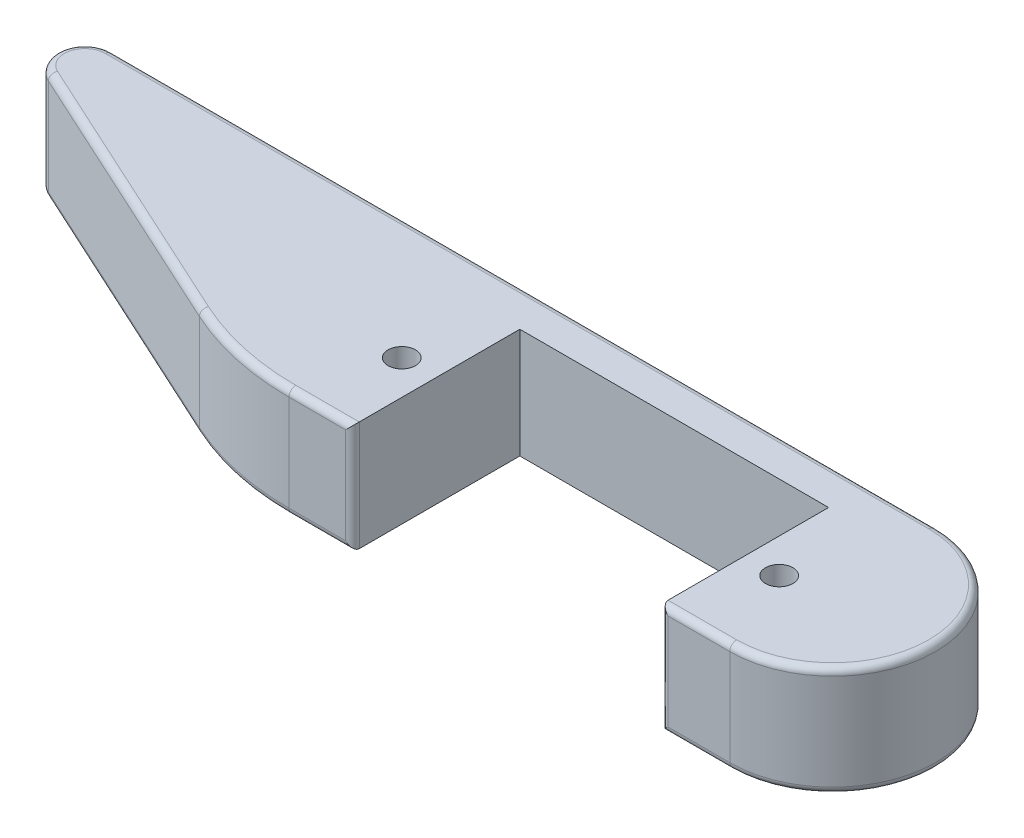
ISO-10303-21;
HEADER;
FILE_DESCRIPTION(('STEP AP214'),'2;1');
FILE_NAME('part.step','',(''),(''),'','','');
FILE_SCHEMA(('AUTOMOTIVE_DESIGN { 1 0 10303 214 1 1 1 1 }'));
ENDSEC;
DATA;
#1=APPLICATION_CONTEXT('core data for automotive mechanical design processes');
#2=APPLICATION_PROTOCOL_DEFINITION('international standard','automotive_design',2000,#1);
#3=PRODUCT_CONTEXT('',#1,'mechanical');
#4=PRODUCT('Part','Part','',(#3));
#5=PRODUCT_RELATED_PRODUCT_CATEGORY('part','',(#4));
#6=PRODUCT_DEFINITION_FORMATION('','',#4);
#7=PRODUCT_DEFINITION_CONTEXT('part definition',#1,'design');
#8=PRODUCT_DEFINITION('design','',#6,#7);
#9=PRODUCT_DEFINITION_SHAPE('','',#8);
#10=(LENGTH_UNIT() NAMED_UNIT(*) SI_UNIT(.MILLI.,.METRE.));
#11=(NAMED_UNIT(*) PLANE_ANGLE_UNIT() SI_UNIT($,.RADIAN.));
#12=(NAMED_UNIT(*) SI_UNIT($,.STERADIAN.) SOLID_ANGLE_UNIT());
#13=UNCERTAINTY_MEASURE_WITH_UNIT(LENGTH_MEASURE(1.E-05),#10,'distance_accuracy_value','');
#14=(GEOMETRIC_REPRESENTATION_CONTEXT(3) GLOBAL_UNCERTAINTY_ASSIGNED_CONTEXT((#13)) GLOBAL_UNIT_ASSIGNED_CONTEXT((#10,
#11,#12)) REPRESENTATION_CONTEXT('',''));
#15=CARTESIAN_POINT('',(0.,0.,0.));
#16=DIRECTION('',(0.,0.,1.));
#17=DIRECTION('',(1.,0.,0.));
#18=AXIS2_PLACEMENT_3D('',#15,#16,#17);
#19=CARTESIAN_POINT('',(-27.1243037321913,8.,-20.));
#20=DIRECTION('',(0.,1.,0.));
#21=DIRECTION('',(0.,0.,1.));
#22=AXIS2_PLACEMENT_3D('',#19,#20,#21);
#23=PLANE('',#22);
#24=DIRECTION('',(0.,0.,1.));
#25=VECTOR('',#24,1.);
#26=CARTESIAN_POINT('',(0.,8.,0.));
#27=LINE('',#26,#25);
#28=CARTESIAN_POINT('',(0.,8.,-12.2));
#29=VERTEX_POINT('',#28);
#30=CARTESIAN_POINT('',(0.,8.,-0.5));
#31=VERTEX_POINT('',#30);
#32=EDGE_CURVE('E183',#29,#31,#27,.T.);
#33=ORIENTED_EDGE('',*,*,#32,.T.);
#34=DIRECTION('',(1.,0.,0.));
#35=VECTOR('',#34,1.);
#36=CARTESIAN_POINT('',(5.,8.,-0.500000000000001));
#37=LINE('',#36,#35);
#38=CARTESIAN_POINT('',(5.,8.,-0.5));
#39=VERTEX_POINT('',#38);
#40=EDGE_CURVE('E223',#31,#39,#37,.T.);
#41=ORIENTED_EDGE('',*,*,#40,.T.);
#42=CARTESIAN_POINT('',(5.,8.,-7.5));
#43=DIRECTION('',(0.,1.,0.));
#44=DIRECTION('',(0.,0.,1.));
#45=AXIS2_PLACEMENT_3D('',#42,#43,#44);
#46=CIRCLE('',#45,7.);
#47=CARTESIAN_POINT('',(5.,8.,-14.5));
#48=VERTEX_POINT('',#47);
#49=EDGE_CURVE('E221',#39,#48,#46,.T.);
#50=ORIENTED_EDGE('',*,*,#49,.T.);
#51=DIRECTION('',(-1.,0.,0.));
#52=VECTOR('',#51,1.);
#53=CARTESIAN_POINT('',(-55.,8.,-14.5));
#54=LINE('',#53,#52);
#55=CARTESIAN_POINT('',(-55.,8.,-14.5));
#56=VERTEX_POINT('',#55);
#57=EDGE_CURVE('E212',#48,#56,#54,.T.);
#58=ORIENTED_EDGE('',*,*,#57,.T.);
#59=CARTESIAN_POINT('',(-55.,8.,-13.));
#60=DIRECTION('',(0.,1.,0.));
#61=DIRECTION('',(0.,0.,1.));
#62=AXIS2_PLACEMENT_3D('',#59,#60,#61);
#63=CIRCLE('',#62,1.5);
#64=CARTESIAN_POINT('',(-55.626320461274,8.,-11.6370169921127));
#65=VERTEX_POINT('',#64);
#66=EDGE_CURVE('E214',#56,#65,#63,.T.);
#67=ORIENTED_EDGE('',*,*,#66,.T.);
#68=DIRECTION('',(0.908655338591524,0.,0.417546974182694));
#69=VECTOR('',#68,1.);
#70=CARTESIAN_POINT('',(-35.2664697287539,8.,-2.2812208974653));
#71=LINE('',#70,#69);
#72=CARTESIAN_POINT('',(-35.2664697287539,8.,-2.2812208974653));
#73=VERTEX_POINT('',#72);
#74=EDGE_CURVE('E216',#65,#73,#71,.T.);
#75=ORIENTED_EDGE('',*,*,#74,.T.);
#76=CARTESIAN_POINT('',(-27.1243037321913,8.,-20.));
#77=DIRECTION('',(0.,1.,0.));
#78=DIRECTION('',(0.,0.,1.));
#79=AXIS2_PLACEMENT_3D('',#76,#77,#78);
#80=CIRCLE('',#79,19.5);
#81=CARTESIAN_POINT('',(-27.1243037321913,8.,-0.500000000000004));
#82=VERTEX_POINT('',#81);
#83=EDGE_CURVE('E218',#73,#82,#80,.T.);
#84=ORIENTED_EDGE('',*,*,#83,.T.);
#85=DIRECTION('',(1.,0.,0.));
#86=VECTOR('',#85,1.);
#87=CARTESIAN_POINT('',(-22.5,8.,-0.499999999999999));
#88=LINE('',#87,#86);
#89=CARTESIAN_POINT('',(-22.5,8.,-0.5));
#90=VERTEX_POINT('',#89);
#91=EDGE_CURVE('E166',#82,#90,#88,.T.);
#92=ORIENTED_EDGE('',*,*,#91,.T.);
#93=DIRECTION('',(0.,0.,-1.));
#94=VECTOR('',#93,1.);
#95=CARTESIAN_POINT('',(-22.5,8.,-12.2));
#96=LINE('',#95,#94);
#97=CARTESIAN_POINT('',(-22.5,8.,-12.2));
#98=VERTEX_POINT('',#97);
#99=EDGE_CURVE('E158',#90,#98,#96,.T.);
#100=ORIENTED_EDGE('',*,*,#99,.T.);
#101=DIRECTION('',(1.,0.,0.));
#102=VECTOR('',#101,1.);
#103=CARTESIAN_POINT('',(0.,8.,-12.2));
#104=LINE('',#103,#102);
#105=EDGE_CURVE('E163',#98,#29,#104,.T.);
#106=ORIENTED_EDGE('',*,*,#105,.T.);
#107=EDGE_LOOP('',(#33,#41,#50,#58,#67,#75,#84,#92,#100,#106));
#108=FACE_BOUND('',#107,.T.);
#109=CARTESIAN_POINT('',(-25.,8.,-6.1));
#110=DIRECTION('',(0.,1.,0.));
#111=DIRECTION('',(0.,0.,1.));
#112=AXIS2_PLACEMENT_3D('',#109,#110,#111);
#113=CIRCLE('',#112,1.);
#114=CARTESIAN_POINT('',(-25.,8.,-5.1));
#115=VERTEX_POINT('',#114);
#116=EDGE_CURVE('E190',#115,#115,#113,.T.);
#117=ORIENTED_EDGE('',*,*,#116,.F.);
#118=EDGE_LOOP('',(#117));
#119=FACE_BOUND('',#118,.T.);
#120=CARTESIAN_POINT('',(2.5,8.,-6.1));
#121=DIRECTION('',(0.,1.,0.));
#122=DIRECTION('',(0.,0.,1.));
#123=AXIS2_PLACEMENT_3D('',#120,#121,#122);
#124=CIRCLE('',#123,1.);
#125=CARTESIAN_POINT('',(2.5,8.,-5.1));
#126=VERTEX_POINT('',#125);
#127=EDGE_CURVE('E322',#126,#126,#124,.T.);
#128=ORIENTED_EDGE('',*,*,#127,.F.);
#129=EDGE_LOOP('',(#128));
#130=FACE_BOUND('',#129,.T.);
#131=ADVANCED_FACE('F33',(#108,#119,#130),#23,.T.);
#132=CARTESIAN_POINT('',(-27.1243037321913,0.,-20.));
#133=DIRECTION('',(0.,1.,0.));
#134=DIRECTION('',(0.,0.,1.));
#135=AXIS2_PLACEMENT_3D('',#132,#133,#134);
#136=PLANE('',#135);
#137=CARTESIAN_POINT('',(-25.,0.,-6.1));
#138=DIRECTION('',(0.,1.,0.));
#139=DIRECTION('',(0.,0.,1.));
#140=AXIS2_PLACEMENT_3D('',#137,#138,#139);
#141=CIRCLE('',#140,1.);
#142=CARTESIAN_POINT('',(-25.,0.,-5.1));
#143=VERTEX_POINT('',#142);
#144=EDGE_CURVE('E327',#143,#143,#141,.T.);
#145=ORIENTED_EDGE('',*,*,#144,.T.);
#146=EDGE_LOOP('',(#145));
#147=FACE_BOUND('',#146,.T.);
#148=CARTESIAN_POINT('',(5.,0.,-7.5));
#149=DIRECTION('',(0.,1.,0.));
#150=DIRECTION('',(0.,0.,1.));
#151=AXIS2_PLACEMENT_3D('',#148,#149,#150);
#152=CIRCLE('',#151,7.);
#153=CARTESIAN_POINT('',(5.,0.,-14.5));
#154=VERTEX_POINT('',#153);
#155=CARTESIAN_POINT('',(5.,0.,-0.5));
#156=VERTEX_POINT('',#155);
#157=EDGE_CURVE('E50',#154,#156,#152,.F.);
#158=ORIENTED_EDGE('',*,*,#157,.T.);
#159=DIRECTION('',(1.,0.,0.));
#160=VECTOR('',#159,1.);
#161=CARTESIAN_POINT('',(-27.1243037321913,0.,-0.5));
#162=LINE('',#161,#160);
#163=CARTESIAN_POINT('',(0.,0.,-0.5));
#164=VERTEX_POINT('',#163);
#165=EDGE_CURVE('E265',#156,#164,#162,.F.);
#166=ORIENTED_EDGE('',*,*,#165,.T.);
#167=DIRECTION('',(0.,0.,1.));
#168=VECTOR('',#167,1.);
#169=CARTESIAN_POINT('',(0.,0.,0.));
#170=LINE('',#169,#168);
#171=CARTESIAN_POINT('',(0.,0.,-12.2));
#172=VERTEX_POINT('',#171);
#173=EDGE_CURVE('E169',#172,#164,#170,.T.);
#174=ORIENTED_EDGE('',*,*,#173,.F.);
#175=DIRECTION('',(1.,0.,0.));
#176=VECTOR('',#175,1.);
#177=CARTESIAN_POINT('',(0.,0.,-12.2));
#178=LINE('',#177,#176);
#179=CARTESIAN_POINT('',(-22.5,0.,-12.2));
#180=VERTEX_POINT('',#179);
#181=EDGE_CURVE('E189',#180,#172,#178,.T.);
#182=ORIENTED_EDGE('',*,*,#181,.F.);
#183=DIRECTION('',(0.,0.,-1.));
#184=VECTOR('',#183,1.);
#185=CARTESIAN_POINT('',(-22.5,0.,-12.2));
#186=LINE('',#185,#184);
#187=CARTESIAN_POINT('',(-22.5,0.,-0.5));
#188=VERTEX_POINT('',#187);
#189=EDGE_CURVE('E174',#188,#180,#186,.T.);
#190=ORIENTED_EDGE('',*,*,#189,.F.);
#191=DIRECTION('',(1.,0.,0.));
#192=VECTOR('',#191,1.);
#193=CARTESIAN_POINT('',(-27.1243037321913,0.,-0.5));
#194=LINE('',#193,#192);
#195=CARTESIAN_POINT('',(-27.1243037321913,0.,-0.500000000000003));
#196=VERTEX_POINT('',#195);
#197=EDGE_CURVE('E57',#188,#196,#194,.F.);
#198=ORIENTED_EDGE('',*,*,#197,.T.);
#199=CARTESIAN_POINT('',(-27.1243037321913,0.,-20.));
#200=DIRECTION('',(0.,1.,0.));
#201=DIRECTION('',(0.,0.,1.));
#202=AXIS2_PLACEMENT_3D('',#199,#200,#201);
#203=CIRCLE('',#202,19.5);
#204=CARTESIAN_POINT('',(-35.2664697287539,0.,-2.28122089746529));
#205=VERTEX_POINT('',#204);
#206=EDGE_CURVE('E261',#196,#205,#203,.F.);
#207=ORIENTED_EDGE('',*,*,#206,.T.);
#208=DIRECTION('',(0.908655338591524,0.,0.417546974182694));
#209=VECTOR('',#208,1.);
#210=CARTESIAN_POINT('',(-35.2664697287539,0.,-2.28122089746529));
#211=LINE('',#210,#209);
#212=CARTESIAN_POINT('',(-55.626320461274,0.,-11.6370169921127));
#213=VERTEX_POINT('',#212);
#214=EDGE_CURVE('E259',#205,#213,#211,.F.);
#215=ORIENTED_EDGE('',*,*,#214,.T.);
#216=CARTESIAN_POINT('',(-55.,0.,-13.));
#217=DIRECTION('',(0.,1.,0.));
#218=DIRECTION('',(0.,0.,1.));
#219=AXIS2_PLACEMENT_3D('',#216,#217,#218);
#220=CIRCLE('',#219,1.5);
#221=CARTESIAN_POINT('',(-55.,0.,-14.5));
#222=VERTEX_POINT('',#221);
#223=EDGE_CURVE('E257',#213,#222,#220,.F.);
#224=ORIENTED_EDGE('',*,*,#223,.T.);
#225=DIRECTION('',(-1.,0.,0.));
#226=VECTOR('',#225,1.);
#227=CARTESIAN_POINT('',(-27.1243037321913,0.,-14.5));
#228=LINE('',#227,#226);
#229=EDGE_CURVE('E255',#222,#154,#228,.F.);
#230=ORIENTED_EDGE('',*,*,#229,.T.);
#231=EDGE_LOOP('',(#158,#166,#174,#182,#190,#198,#207,#215,#224,#230));
#232=FACE_BOUND('',#231,.T.);
#233=CARTESIAN_POINT('',(2.5,0.,-6.1));
#234=DIRECTION('',(0.,1.,0.));
#235=DIRECTION('',(0.,0.,1.));
#236=AXIS2_PLACEMENT_3D('',#233,#234,#235);
#237=CIRCLE('',#236,1.);
#238=CARTESIAN_POINT('',(2.5,0.,-5.1));
#239=VERTEX_POINT('',#238);
#240=EDGE_CURVE('E317',#239,#239,#237,.T.);
#241=ORIENTED_EDGE('',*,*,#240,.T.);
#242=EDGE_LOOP('',(#241));
#243=FACE_BOUND('',#242,.T.);
#244=ADVANCED_FACE('F334',(#147,#232,#243),#136,.F.);
#245=CARTESIAN_POINT('',(5.,8.,0.));
#246=DIRECTION('',(0.,0.,-1.));
#247=DIRECTION('',(-1.,0.,0.));
#248=AXIS2_PLACEMENT_3D('',#245,#246,#247);
#249=PLANE('',#248);
#250=DIRECTION('',(0.,-1.,0.));
#251=VECTOR('',#250,1.);
#252=CARTESIAN_POINT('',(5.,8.,0.));
#253=LINE('',#252,#251);
#254=CARTESIAN_POINT('',(5.,7.5,0.));
#255=VERTEX_POINT('',#254);
#256=CARTESIAN_POINT('',(5.,0.5,0.));
#257=VERTEX_POINT('',#256);
#258=EDGE_CURVE('E209',#255,#257,#253,.T.);
#259=ORIENTED_EDGE('',*,*,#258,.F.);
#260=DIRECTION('',(1.,0.,0.));
#261=VECTOR('',#260,1.);
#262=CARTESIAN_POINT('',(0.,7.5,0.));
#263=LINE('',#262,#261);
#264=CARTESIAN_POINT('',(0.5,7.5,0.));
#265=VERTEX_POINT('',#264);
#266=EDGE_CURVE('E230',#255,#265,#263,.F.);
#267=ORIENTED_EDGE('',*,*,#266,.T.);
#268=DIRECTION('',(0.,-1.,0.));
#269=VECTOR('',#268,1.);
#270=CARTESIAN_POINT('',(0.5,8.,0.));
#271=LINE('',#270,#269);
#272=CARTESIAN_POINT('',(0.5,0.5,0.));
#273=VERTEX_POINT('',#272);
#274=EDGE_CURVE('E226',#265,#273,#271,.T.);
#275=ORIENTED_EDGE('',*,*,#274,.T.);
#276=DIRECTION('',(1.,0.,0.));
#277=VECTOR('',#276,1.);
#278=CARTESIAN_POINT('',(5.,0.5,0.));
#279=LINE('',#278,#277);
#280=EDGE_CURVE('E228',#273,#257,#279,.T.);
#281=ORIENTED_EDGE('',*,*,#280,.T.);
#282=EDGE_LOOP('',(#259,#267,#275,#281));
#283=FACE_BOUND('',#282,.T.);
#284=ADVANCED_FACE('F355',(#283),#249,.F.);
#285=CARTESIAN_POINT('',(5.,8.,-7.5));
#286=DIRECTION('',(0.,-1.,0.));
#287=DIRECTION('',(0.,0.,-1.));
#288=AXIS2_PLACEMENT_3D('',#285,#286,#287);
#289=CYLINDRICAL_SURFACE('',#288,7.5);
#290=DIRECTION('',(0.,-1.,0.));
#291=VECTOR('',#290,1.);
#292=CARTESIAN_POINT('',(5.,8.,-15.));
#293=LINE('',#292,#291);
#294=CARTESIAN_POINT('',(5.,7.5,-15.));
#295=VERTEX_POINT('',#294);
#296=CARTESIAN_POINT('',(5.,0.5,-15.));
#297=VERTEX_POINT('',#296);
#298=EDGE_CURVE('E206',#295,#297,#293,.T.);
#299=ORIENTED_EDGE('',*,*,#298,.F.);
#300=CARTESIAN_POINT('',(5.,7.5,-7.5));
#301=DIRECTION('',(0.,1.,0.));
#302=DIRECTION('',(0.,0.,1.));
#303=AXIS2_PLACEMENT_3D('',#300,#301,#302);
#304=CIRCLE('',#303,7.5);
#305=EDGE_CURVE('E235',#295,#255,#304,.F.);
#306=ORIENTED_EDGE('',*,*,#305,.T.);
#307=ORIENTED_EDGE('',*,*,#258,.T.);
#308=CARTESIAN_POINT('',(5.,0.5,-7.5));
#309=DIRECTION('',(0.,1.,0.));
#310=DIRECTION('',(0.,0.,1.));
#311=AXIS2_PLACEMENT_3D('',#308,#309,#310);
#312=CIRCLE('',#311,7.5);
#313=EDGE_CURVE('E233',#257,#297,#312,.T.);
#314=ORIENTED_EDGE('',*,*,#313,.T.);
#315=EDGE_LOOP('',(#299,#306,#307,#314));
#316=FACE_BOUND('',#315,.T.);
#317=ADVANCED_FACE('F381',(#316),#289,.T.);
#318=CARTESIAN_POINT('',(5.,8.,-15.));
#319=DIRECTION('',(0.,0.,1.));
#320=DIRECTION('',(1.,0.,0.));
#321=AXIS2_PLACEMENT_3D('',#318,#319,#320);
#322=PLANE('',#321);
#323=DIRECTION('',(0.,-1.,0.));
#324=VECTOR('',#323,1.);
#325=CARTESIAN_POINT('',(-55.,8.,-15.));
#326=LINE('',#325,#324);
#327=CARTESIAN_POINT('',(-55.,7.5,-15.));
#328=VERTEX_POINT('',#327);
#329=CARTESIAN_POINT('',(-55.,0.5,-15.));
#330=VERTEX_POINT('',#329);
#331=EDGE_CURVE('E203',#328,#330,#326,.T.);
#332=ORIENTED_EDGE('',*,*,#331,.F.);
#333=DIRECTION('',(-1.,0.,0.));
#334=VECTOR('',#333,1.);
#335=CARTESIAN_POINT('',(5.,7.5,-15.));
#336=LINE('',#335,#334);
#337=EDGE_CURVE('E269',#328,#295,#336,.F.);
#338=ORIENTED_EDGE('',*,*,#337,.T.);
#339=ORIENTED_EDGE('',*,*,#298,.T.);
#340=DIRECTION('',(-1.,0.,0.));
#341=VECTOR('',#340,1.);
#342=CARTESIAN_POINT('',(5.,0.5,-15.));
#343=LINE('',#342,#341);
#344=EDGE_CURVE('E267',#297,#330,#343,.T.);
#345=ORIENTED_EDGE('',*,*,#344,.T.);
#346=EDGE_LOOP('',(#332,#338,#339,#345));
#347=FACE_BOUND('',#346,.T.);
#348=ADVANCED_FACE('F377',(#347),#322,.F.);
#349=CARTESIAN_POINT('',(-55.,8.,-13.));
#350=DIRECTION('',(0.,-1.,0.));
#351=DIRECTION('',(0.,0.,-1.));
#352=AXIS2_PLACEMENT_3D('',#349,#350,#351);
#353=CYLINDRICAL_SURFACE('',#352,2.);
#354=DIRECTION('',(0.,-1.,0.));
#355=VECTOR('',#354,1.);
#356=CARTESIAN_POINT('',(-55.8350939483654,8.,-11.1826893228169));
#357=LINE('',#356,#355);
#358=CARTESIAN_POINT('',(-55.8350939483654,7.5,-11.1826893228169));
#359=VERTEX_POINT('',#358);
#360=CARTESIAN_POINT('',(-55.8350939483654,0.5,-11.1826893228169));
#361=VERTEX_POINT('',#360);
#362=EDGE_CURVE('E200',#359,#361,#357,.T.);
#363=ORIENTED_EDGE('',*,*,#362,.F.);
#364=CARTESIAN_POINT('',(-55.,7.5,-13.));
#365=DIRECTION('',(0.,1.,0.));
#366=DIRECTION('',(0.,0.,1.));
#367=AXIS2_PLACEMENT_3D('',#364,#365,#366);
#368=CIRCLE('',#367,2.);
#369=EDGE_CURVE('E253',#359,#328,#368,.F.);
#370=ORIENTED_EDGE('',*,*,#369,.T.);
#371=ORIENTED_EDGE('',*,*,#331,.T.);
#372=CARTESIAN_POINT('',(-55.,0.5,-13.));
#373=DIRECTION('',(0.,1.,0.));
#374=DIRECTION('',(0.,0.,1.));
#375=AXIS2_PLACEMENT_3D('',#372,#373,#374);
#376=CIRCLE('',#375,2.);
#377=EDGE_CURVE('E251',#330,#361,#376,.T.);
#378=ORIENTED_EDGE('',*,*,#377,.T.);
#379=EDGE_LOOP('',(#363,#370,#371,#378));
#380=FACE_BOUND('',#379,.T.);
#381=ADVANCED_FACE('F373',(#380),#353,.T.);
#382=CARTESIAN_POINT('',(-55.8350939483654,8.,-11.1826893228169));
#383=DIRECTION('',(0.417546974182694,0.,-0.908655338591524));
#384=DIRECTION('',(-0.908655338591524,0.,-0.417546974182694));
#385=AXIS2_PLACEMENT_3D('',#382,#383,#384);
#386=PLANE('',#385);
#387=DIRECTION('',(0.,-1.,0.));
#388=VECTOR('',#387,1.);
#389=CARTESIAN_POINT('',(-35.4752432158452,8.,-1.82689322816953));
#390=LINE('',#389,#388);
#391=CARTESIAN_POINT('',(-35.4752432158452,7.5,-1.82689322816953));
#392=VERTEX_POINT('',#391);
#393=CARTESIAN_POINT('',(-35.4752432158452,0.5,-1.82689322816953));
#394=VERTEX_POINT('',#393);
#395=EDGE_CURVE('E197',#392,#394,#390,.T.);
#396=ORIENTED_EDGE('',*,*,#395,.F.);
#397=DIRECTION('',(0.908655338591524,0.,0.417546974182694));
#398=VECTOR('',#397,1.);
#399=CARTESIAN_POINT('',(-55.8350939483654,7.5,-11.1826893228169));
#400=LINE('',#399,#398);
#401=EDGE_CURVE('E249',#392,#359,#400,.F.);
#402=ORIENTED_EDGE('',*,*,#401,.T.);
#403=ORIENTED_EDGE('',*,*,#362,.T.);
#404=DIRECTION('',(0.908655338591524,0.,0.417546974182694));
#405=VECTOR('',#404,1.);
#406=CARTESIAN_POINT('',(-55.8350939483654,0.5,-11.1826893228169));
#407=LINE('',#406,#405);
#408=EDGE_CURVE('E247',#361,#394,#407,.T.);
#409=ORIENTED_EDGE('',*,*,#408,.T.);
#410=EDGE_LOOP('',(#396,#402,#403,#409));
#411=FACE_BOUND('',#410,.T.);
#412=ADVANCED_FACE('F369',(#411),#386,.F.);
#413=CARTESIAN_POINT('',(-27.1243037321913,8.,-20.));
#414=DIRECTION('',(0.,-1.,0.));
#415=DIRECTION('',(0.,0.,-1.));
#416=AXIS2_PLACEMENT_3D('',#413,#414,#415);
#417=CYLINDRICAL_SURFACE('',#416,20.);
#418=DIRECTION('',(0.,-1.,0.));
#419=VECTOR('',#418,1.);
#420=CARTESIAN_POINT('',(-27.1243037321913,8.,0.));
#421=LINE('',#420,#419);
#422=CARTESIAN_POINT('',(-27.1243037321913,7.5,0.));
#423=VERTEX_POINT('',#422);
#424=CARTESIAN_POINT('',(-27.1243037321913,0.5,0.));
#425=VERTEX_POINT('',#424);
#426=EDGE_CURVE('E177',#423,#425,#421,.T.);
#427=ORIENTED_EDGE('',*,*,#426,.F.);
#428=CARTESIAN_POINT('',(-27.1243037321913,7.5,-20.));
#429=DIRECTION('',(0.,1.,0.));
#430=DIRECTION('',(0.,0.,1.));
#431=AXIS2_PLACEMENT_3D('',#428,#429,#430);
#432=CIRCLE('',#431,20.);
#433=EDGE_CURVE('E245',#423,#392,#432,.F.);
#434=ORIENTED_EDGE('',*,*,#433,.T.);
#435=ORIENTED_EDGE('',*,*,#395,.T.);
#436=CARTESIAN_POINT('',(-27.1243037321913,0.5,-20.));
#437=DIRECTION('',(0.,1.,0.));
#438=DIRECTION('',(0.,0.,1.));
#439=AXIS2_PLACEMENT_3D('',#436,#437,#438);
#440=CIRCLE('',#439,20.);
#441=EDGE_CURVE('E243',#394,#425,#440,.T.);
#442=ORIENTED_EDGE('',*,*,#441,.T.);
#443=EDGE_LOOP('',(#427,#434,#435,#442));
#444=FACE_BOUND('',#443,.T.);
#445=ADVANCED_FACE('F365',(#444),#417,.T.);
#446=CARTESIAN_POINT('',(-27.1243037321913,8.,0.));
#447=DIRECTION('',(0.,0.,-1.));
#448=DIRECTION('',(-1.,0.,0.));
#449=AXIS2_PLACEMENT_3D('',#446,#447,#448);
#450=PLANE('',#449);
#451=DIRECTION('',(0.,-1.,0.));
#452=VECTOR('',#451,1.);
#453=CARTESIAN_POINT('',(-23.,8.,0.));
#454=LINE('',#453,#452);
#455=CARTESIAN_POINT('',(-23.,0.5,0.));
#456=VERTEX_POINT('',#455);
#457=CARTESIAN_POINT('',(-23.,7.5,0.));
#458=VERTEX_POINT('',#457);
#459=EDGE_CURVE('E237',#456,#458,#454,.F.);
#460=ORIENTED_EDGE('',*,*,#459,.T.);
#461=DIRECTION('',(1.,0.,0.));
#462=VECTOR('',#461,1.);
#463=CARTESIAN_POINT('',(-27.1243037321913,7.5,0.));
#464=LINE('',#463,#462);
#465=EDGE_CURVE('E241',#458,#423,#464,.F.);
#466=ORIENTED_EDGE('',*,*,#465,.T.);
#467=ORIENTED_EDGE('',*,*,#426,.T.);
#468=DIRECTION('',(1.,0.,0.));
#469=VECTOR('',#468,1.);
#470=CARTESIAN_POINT('',(-27.1243037321913,0.5,0.));
#471=LINE('',#470,#469);
#472=EDGE_CURVE('E239',#425,#456,#471,.T.);
#473=ORIENTED_EDGE('',*,*,#472,.T.);
#474=EDGE_LOOP('',(#460,#466,#467,#473));
#475=FACE_BOUND('',#474,.T.);
#476=ADVANCED_FACE('F362',(#475),#450,.F.);
#477=CARTESIAN_POINT('',(-22.5,8.,-12.2));
#478=DIRECTION('',(-1.,0.,0.));
#479=DIRECTION('',(0.,0.,1.));
#480=AXIS2_PLACEMENT_3D('',#477,#478,#479);
#481=PLANE('',#480);
#482=ORIENTED_EDGE('',*,*,#99,.F.);
#483=DIRECTION('',(0.,-1.,0.));
#484=VECTOR('',#483,1.);
#485=CARTESIAN_POINT('',(-22.5,8.,-0.499999999999999));
#486=LINE('',#485,#484);
#487=EDGE_CURVE('E11',#90,#188,#486,.T.);
#488=ORIENTED_EDGE('',*,*,#487,.T.);
#489=ORIENTED_EDGE('',*,*,#189,.T.);
#490=DIRECTION('',(0.,-1.,0.));
#491=VECTOR('',#490,1.);
#492=CARTESIAN_POINT('',(-22.5,8.,-12.2));
#493=LINE('',#492,#491);
#494=EDGE_CURVE('E172',#98,#180,#493,.T.);
#495=ORIENTED_EDGE('',*,*,#494,.F.);
#496=EDGE_LOOP('',(#482,#488,#489,#495));
#497=FACE_BOUND('',#496,.T.);
#498=ADVANCED_FACE('F173',(#497),#481,.F.);
#499=CARTESIAN_POINT('',(0.,8.,-12.2));
#500=DIRECTION('',(0.,0.,-1.));
#501=DIRECTION('',(-1.,0.,0.));
#502=AXIS2_PLACEMENT_3D('',#499,#500,#501);
#503=PLANE('',#502);
#504=ORIENTED_EDGE('',*,*,#181,.T.);
#505=DIRECTION('',(0.,-1.,0.));
#506=VECTOR('',#505,1.);
#507=CARTESIAN_POINT('',(0.,8.,-12.2));
#508=LINE('',#507,#506);
#509=EDGE_CURVE('E178',#29,#172,#508,.T.);
#510=ORIENTED_EDGE('',*,*,#509,.F.);
#511=ORIENTED_EDGE('',*,*,#105,.F.);
#512=ORIENTED_EDGE('',*,*,#494,.T.);
#513=EDGE_LOOP('',(#504,#510,#511,#512));
#514=FACE_BOUND('',#513,.T.);
#515=ADVANCED_FACE('F180',(#514),#503,.F.);
#516=CARTESIAN_POINT('',(0.,8.,0.));
#517=DIRECTION('',(1.,0.,0.));
#518=DIRECTION('',(0.,0.,-1.));
#519=AXIS2_PLACEMENT_3D('',#516,#517,#518);
#520=PLANE('',#519);
#521=ORIENTED_EDGE('',*,*,#173,.T.);
#522=DIRECTION('',(0.,-1.,0.));
#523=VECTOR('',#522,1.);
#524=CARTESIAN_POINT('',(0.,8.,-0.5));
#525=LINE('',#524,#523);
#526=EDGE_CURVE('E42',#164,#31,#525,.F.);
#527=ORIENTED_EDGE('',*,*,#526,.T.);
#528=ORIENTED_EDGE('',*,*,#32,.F.);
#529=ORIENTED_EDGE('',*,*,#509,.T.);
#530=EDGE_LOOP('',(#521,#527,#528,#529));
#531=FACE_BOUND('',#530,.T.);
#532=ADVANCED_FACE('F339',(#531),#520,.F.);
#533=CARTESIAN_POINT('',(-25.,8.,-6.1));
#534=DIRECTION('',(0.,-1.,0.));
#535=DIRECTION('',(0.,0.,-1.));
#536=AXIS2_PLACEMENT_3D('',#533,#534,#535);
#537=CYLINDRICAL_SURFACE('',#536,1.);
#538=ORIENTED_EDGE('',*,*,#116,.T.);
#539=EDGE_LOOP('',(#538));
#540=FACE_BOUND('',#539,.T.);
#541=ORIENTED_EDGE('',*,*,#144,.F.);
#542=EDGE_LOOP('',(#541));
#543=FACE_BOUND('',#542,.T.);
#544=ADVANCED_FACE('F336',(#540,#543),#537,.F.);
#545=CARTESIAN_POINT('',(2.5,8.,-6.1));
#546=DIRECTION('',(0.,-1.,0.));
#547=DIRECTION('',(0.,0.,-1.));
#548=AXIS2_PLACEMENT_3D('',#545,#546,#547);
#549=CYLINDRICAL_SURFACE('',#548,1.);
#550=ORIENTED_EDGE('',*,*,#127,.T.);
#551=EDGE_LOOP('',(#550));
#552=FACE_BOUND('',#551,.T.);
#553=ORIENTED_EDGE('',*,*,#240,.F.);
#554=EDGE_LOOP('',(#553));
#555=FACE_BOUND('',#554,.T.);
#556=ADVANCED_FACE('F338',(#552,#555),#549,.F.);
#557=CARTESIAN_POINT('',(-27.1243037321913,0.5,-0.5));
#558=DIRECTION('',(1.,0.,0.));
#559=DIRECTION('',(0.,0.,-1.));
#560=AXIS2_PLACEMENT_3D('',#557,#558,#559);
#561=CYLINDRICAL_SURFACE('',#560,0.5);
#562=CARTESIAN_POINT('',(-23.,0.5,-0.499999999999999));
#563=DIRECTION('',(-0.707106781186547,-0.707106781186547,0.));
#564=DIRECTION('',(0.707106781186547,-0.707106781186547,0.));
#565=AXIS2_PLACEMENT_3D('',#562,#563,#564);
#566=ELLIPSE('',#565,0.707106781186547,0.5);
#567=EDGE_CURVE('E311',#456,#188,#566,.F.);
#568=ORIENTED_EDGE('',*,*,#567,.F.);
#569=ORIENTED_EDGE('',*,*,#472,.F.);
#570=CARTESIAN_POINT('',(-27.1243037321913,0.5,-0.5));
#571=DIRECTION('',(-1.,0.,0.));
#572=DIRECTION('',(0.,0.,1.));
#573=AXIS2_PLACEMENT_3D('',#570,#571,#572);
#574=CIRCLE('',#573,0.5);
#575=EDGE_CURVE('E37',#196,#425,#574,.T.);
#576=ORIENTED_EDGE('',*,*,#575,.F.);
#577=ORIENTED_EDGE('',*,*,#197,.F.);
#578=EDGE_LOOP('',(#568,#569,#576,#577));
#579=FACE_BOUND('',#578,.T.);
#580=ADVANCED_FACE('F35',(#579),#561,.T.);
#581=CARTESIAN_POINT('',(-27.1243037321913,0.5,-20.));
#582=DIRECTION('',(0.,1.,0.));
#583=DIRECTION('',(0.,0.,1.));
#584=AXIS2_PLACEMENT_3D('',#581,#582,#583);
#585=TOROIDAL_SURFACE('',#584,19.5,0.5);
#586=ORIENTED_EDGE('',*,*,#575,.T.);
#587=ORIENTED_EDGE('',*,*,#441,.F.);
#588=CARTESIAN_POINT('',(-35.2664697287539,0.5,-2.28122089746529));
#589=DIRECTION('',(-0.908655338591522,0.,-0.417546974182697));
#590=DIRECTION('',(-0.417546974182697,0.,0.908655338591522));
#591=AXIS2_PLACEMENT_3D('',#588,#589,#590);
#592=CIRCLE('',#591,0.5);
#593=EDGE_CURVE('E309',#205,#394,#592,.T.);
#594=ORIENTED_EDGE('',*,*,#593,.F.);
#595=ORIENTED_EDGE('',*,*,#206,.F.);
#596=EDGE_LOOP('',(#586,#587,#594,#595));
#597=FACE_BOUND('',#596,.T.);
#598=ADVANCED_FACE('F443',(#597),#585,.T.);
#599=CARTESIAN_POINT('',(-23.,8.,-0.499999999999999));
#600=DIRECTION('',(0.,-1.,0.));
#601=DIRECTION('',(0.,0.,-1.));
#602=AXIS2_PLACEMENT_3D('',#599,#600,#601);
#603=CYLINDRICAL_SURFACE('',#602,0.5);
#604=ORIENTED_EDGE('',*,*,#567,.T.);
#605=ORIENTED_EDGE('',*,*,#487,.F.);
#606=CARTESIAN_POINT('',(-23.,7.5,-0.499999999999999));
#607=DIRECTION('',(0.707106781186547,-0.707106781186547,0.));
#608=DIRECTION('',(-0.707106781186547,-0.707106781186547,0.));
#609=AXIS2_PLACEMENT_3D('',#606,#607,#608);
#610=ELLIPSE('',#609,0.707106781186547,0.5);
#611=EDGE_CURVE('E306',#458,#90,#610,.F.);
#612=ORIENTED_EDGE('',*,*,#611,.F.);
#613=ORIENTED_EDGE('',*,*,#459,.F.);
#614=EDGE_LOOP('',(#604,#605,#612,#613));
#615=FACE_BOUND('',#614,.T.);
#616=ADVANCED_FACE('F440',(#615),#603,.T.);
#617=CARTESIAN_POINT('',(-55.626320461274,0.5,-11.6370169921127));
#618=DIRECTION('',(0.908655338591524,0.,0.417546974182694));
#619=DIRECTION('',(0.417546974182694,0.,-0.908655338591524));
#620=AXIS2_PLACEMENT_3D('',#617,#618,#619);
#621=CYLINDRICAL_SURFACE('',#620,0.5);
#622=ORIENTED_EDGE('',*,*,#593,.T.);
#623=ORIENTED_EDGE('',*,*,#408,.F.);
#624=CARTESIAN_POINT('',(-55.626320461274,0.5,-11.6370169921127));
#625=DIRECTION('',(-0.908655338591522,0.,-0.417546974182697));
#626=DIRECTION('',(-0.417546974182697,0.,0.908655338591522));
#627=AXIS2_PLACEMENT_3D('',#624,#625,#626);
#628=CIRCLE('',#627,0.5);
#629=EDGE_CURVE('E303',#213,#361,#628,.T.);
#630=ORIENTED_EDGE('',*,*,#629,.F.);
#631=ORIENTED_EDGE('',*,*,#214,.F.);
#632=EDGE_LOOP('',(#622,#623,#630,#631));
#633=FACE_BOUND('',#632,.T.);
#634=ADVANCED_FACE('F436',(#633),#621,.T.);
#635=CARTESIAN_POINT('',(-27.1243037321913,7.5,-0.5));
#636=DIRECTION('',(-1.,0.,0.));
#637=DIRECTION('',(0.,0.,1.));
#638=AXIS2_PLACEMENT_3D('',#635,#636,#637);
#639=CYLINDRICAL_SURFACE('',#638,0.5);
#640=ORIENTED_EDGE('',*,*,#611,.T.);
#641=ORIENTED_EDGE('',*,*,#91,.F.);
#642=CARTESIAN_POINT('',(-27.1243037321913,7.5,-0.5));
#643=DIRECTION('',(-1.,0.,0.));
#644=DIRECTION('',(0.,0.,1.));
#645=AXIS2_PLACEMENT_3D('',#642,#643,#644);
#646=CIRCLE('',#645,0.5);
#647=EDGE_CURVE('E300',#423,#82,#646,.T.);
#648=ORIENTED_EDGE('',*,*,#647,.F.);
#649=ORIENTED_EDGE('',*,*,#465,.F.);
#650=EDGE_LOOP('',(#640,#641,#648,#649));
#651=FACE_BOUND('',#650,.T.);
#652=ADVANCED_FACE('F432',(#651),#639,.T.);
#653=CARTESIAN_POINT('',(-55.,0.5,-13.));
#654=DIRECTION('',(0.,1.,0.));
#655=DIRECTION('',(0.,0.,1.));
#656=AXIS2_PLACEMENT_3D('',#653,#654,#655);
#657=TOROIDAL_SURFACE('',#656,1.5,0.5);
#658=ORIENTED_EDGE('',*,*,#629,.T.);
#659=ORIENTED_EDGE('',*,*,#377,.F.);
#660=CARTESIAN_POINT('',(-55.,0.5,-14.5));
#661=DIRECTION('',(1.,0.,0.));
#662=DIRECTION('',(0.,0.,-1.));
#663=AXIS2_PLACEMENT_3D('',#660,#661,#662);
#664=CIRCLE('',#663,0.5);
#665=EDGE_CURVE('E297',#222,#330,#664,.T.);
#666=ORIENTED_EDGE('',*,*,#665,.F.);
#667=ORIENTED_EDGE('',*,*,#223,.F.);
#668=EDGE_LOOP('',(#658,#659,#666,#667));
#669=FACE_BOUND('',#668,.T.);
#670=ADVANCED_FACE('F428',(#669),#657,.T.);
#671=CARTESIAN_POINT('',(-27.1243037321913,7.5,-20.));
#672=DIRECTION('',(0.,1.,0.));
#673=DIRECTION('',(0.,0.,1.));
#674=AXIS2_PLACEMENT_3D('',#671,#672,#673);
#675=TOROIDAL_SURFACE('',#674,19.5,0.5);
#676=ORIENTED_EDGE('',*,*,#647,.T.);
#677=ORIENTED_EDGE('',*,*,#83,.F.);
#678=CARTESIAN_POINT('',(-35.2664697287539,7.5,-2.28122089746529));
#679=DIRECTION('',(-0.908655338591522,0.,-0.417546974182697));
#680=DIRECTION('',(-0.417546974182697,0.,0.908655338591523));
#681=AXIS2_PLACEMENT_3D('',#678,#679,#680);
#682=CIRCLE('',#681,0.5);
#683=EDGE_CURVE('E294',#392,#73,#682,.T.);
#684=ORIENTED_EDGE('',*,*,#683,.F.);
#685=ORIENTED_EDGE('',*,*,#433,.F.);
#686=EDGE_LOOP('',(#676,#677,#684,#685));
#687=FACE_BOUND('',#686,.T.);
#688=ADVANCED_FACE('F424',(#687),#675,.T.);
#689=CARTESIAN_POINT('',(5.,0.5,-14.5));
#690=DIRECTION('',(-1.,0.,0.));
#691=DIRECTION('',(0.,0.,1.));
#692=AXIS2_PLACEMENT_3D('',#689,#690,#691);
#693=CYLINDRICAL_SURFACE('',#692,0.5);
#694=ORIENTED_EDGE('',*,*,#665,.T.);
#695=ORIENTED_EDGE('',*,*,#344,.F.);
#696=CARTESIAN_POINT('',(5.,0.5,-14.5));
#697=DIRECTION('',(1.,0.,0.));
#698=DIRECTION('',(0.,0.,-1.));
#699=AXIS2_PLACEMENT_3D('',#696,#697,#698);
#700=CIRCLE('',#699,0.5);
#701=EDGE_CURVE('E291',#154,#297,#700,.T.);
#702=ORIENTED_EDGE('',*,*,#701,.F.);
#703=ORIENTED_EDGE('',*,*,#229,.F.);
#704=EDGE_LOOP('',(#694,#695,#702,#703));
#705=FACE_BOUND('',#704,.T.);
#706=ADVANCED_FACE('F420',(#705),#693,.T.);
#707=CARTESIAN_POINT('',(-35.2664697287539,7.5,-2.28122089746529));
#708=DIRECTION('',(-0.908655338591524,0.,-0.417546974182694));
#709=DIRECTION('',(-0.417546974182694,0.,0.908655338591524));
#710=AXIS2_PLACEMENT_3D('',#707,#708,#709);
#711=CYLINDRICAL_SURFACE('',#710,0.5);
#712=ORIENTED_EDGE('',*,*,#683,.T.);
#713=ORIENTED_EDGE('',*,*,#74,.F.);
#714=CARTESIAN_POINT('',(-55.626320461274,7.5,-11.6370169921127));
#715=DIRECTION('',(-0.908655338591522,0.,-0.417546974182697));
#716=DIRECTION('',(-0.417546974182697,0.,0.908655338591523));
#717=AXIS2_PLACEMENT_3D('',#714,#715,#716);
#718=CIRCLE('',#717,0.5);
#719=EDGE_CURVE('E288',#359,#65,#718,.T.);
#720=ORIENTED_EDGE('',*,*,#719,.F.);
#721=ORIENTED_EDGE('',*,*,#401,.F.);
#722=EDGE_LOOP('',(#712,#713,#720,#721));
#723=FACE_BOUND('',#722,.T.);
#724=ADVANCED_FACE('F416',(#723),#711,.T.);
#725=CARTESIAN_POINT('',(5.,0.5,-7.5));
#726=DIRECTION('',(0.,1.,0.));
#727=DIRECTION('',(0.,0.,1.));
#728=AXIS2_PLACEMENT_3D('',#725,#726,#727);
#729=TOROIDAL_SURFACE('',#728,7.,0.5);
#730=ORIENTED_EDGE('',*,*,#701,.T.);
#731=ORIENTED_EDGE('',*,*,#313,.F.);
#732=CARTESIAN_POINT('',(5.,0.5,-0.5));
#733=DIRECTION('',(-1.,0.,0.));
#734=DIRECTION('',(0.,0.,1.));
#735=AXIS2_PLACEMENT_3D('',#732,#733,#734);
#736=CIRCLE('',#735,0.5);
#737=EDGE_CURVE('E285',#156,#257,#736,.T.);
#738=ORIENTED_EDGE('',*,*,#737,.F.);
#739=ORIENTED_EDGE('',*,*,#157,.F.);
#740=EDGE_LOOP('',(#730,#731,#738,#739));
#741=FACE_BOUND('',#740,.T.);
#742=ADVANCED_FACE('F412',(#741),#729,.T.);
#743=CARTESIAN_POINT('',(-55.,7.5,-13.));
#744=DIRECTION('',(0.,1.,0.));
#745=DIRECTION('',(0.,0.,1.));
#746=AXIS2_PLACEMENT_3D('',#743,#744,#745);
#747=TOROIDAL_SURFACE('',#746,1.5,0.5);
#748=ORIENTED_EDGE('',*,*,#719,.T.);
#749=ORIENTED_EDGE('',*,*,#66,.F.);
#750=CARTESIAN_POINT('',(-55.,7.5,-14.5));
#751=DIRECTION('',(1.,0.,0.));
#752=DIRECTION('',(0.,0.,-1.));
#753=AXIS2_PLACEMENT_3D('',#750,#751,#752);
#754=CIRCLE('',#753,0.5);
#755=EDGE_CURVE('E282',#328,#56,#754,.T.);
#756=ORIENTED_EDGE('',*,*,#755,.F.);
#757=ORIENTED_EDGE('',*,*,#369,.F.);
#758=EDGE_LOOP('',(#748,#749,#756,#757));
#759=FACE_BOUND('',#758,.T.);
#760=ADVANCED_FACE('F408',(#759),#747,.T.);
#761=CARTESIAN_POINT('',(5.,0.5,-0.5));
#762=DIRECTION('',(1.,0.,0.));
#763=DIRECTION('',(0.,0.,-1.));
#764=AXIS2_PLACEMENT_3D('',#761,#762,#763);
#765=CYLINDRICAL_SURFACE('',#764,0.5);
#766=ORIENTED_EDGE('',*,*,#737,.T.);
#767=ORIENTED_EDGE('',*,*,#280,.F.);
#768=CARTESIAN_POINT('',(0.5,0.5,-0.5));
#769=DIRECTION('',(0.707106781186547,-0.707106781186547,0.));
#770=DIRECTION('',(-0.707106781186547,-0.707106781186547,0.));
#771=AXIS2_PLACEMENT_3D('',#768,#769,#770);
#772=ELLIPSE('',#771,0.707106781186547,0.5);
#773=EDGE_CURVE('E279',#164,#273,#772,.F.);
#774=ORIENTED_EDGE('',*,*,#773,.F.);
#775=ORIENTED_EDGE('',*,*,#165,.F.);
#776=EDGE_LOOP('',(#766,#767,#774,#775));
#777=FACE_BOUND('',#776,.T.);
#778=ADVANCED_FACE('F404',(#777),#765,.T.);
#779=CARTESIAN_POINT('',(-27.1243037321913,7.5,-14.5));
#780=DIRECTION('',(1.,0.,0.));
#781=DIRECTION('',(0.,0.,-1.));
#782=AXIS2_PLACEMENT_3D('',#779,#780,#781);
#783=CYLINDRICAL_SURFACE('',#782,0.5);
#784=ORIENTED_EDGE('',*,*,#755,.T.);
#785=ORIENTED_EDGE('',*,*,#57,.F.);
#786=CARTESIAN_POINT('',(5.,7.5,-14.5));
#787=DIRECTION('',(1.,0.,0.));
#788=DIRECTION('',(0.,0.,-1.));
#789=AXIS2_PLACEMENT_3D('',#786,#787,#788);
#790=CIRCLE('',#789,0.5);
#791=EDGE_CURVE('E276',#295,#48,#790,.T.);
#792=ORIENTED_EDGE('',*,*,#791,.F.);
#793=ORIENTED_EDGE('',*,*,#337,.F.);
#794=EDGE_LOOP('',(#784,#785,#792,#793));
#795=FACE_BOUND('',#794,.T.);
#796=ADVANCED_FACE('F400',(#795),#783,.T.);
#797=CARTESIAN_POINT('',(0.5,8.,-0.5));
#798=DIRECTION('',(0.,-1.,0.));
#799=DIRECTION('',(0.,0.,-1.));
#800=AXIS2_PLACEMENT_3D('',#797,#798,#799);
#801=CYLINDRICAL_SURFACE('',#800,0.5);
#802=ORIENTED_EDGE('',*,*,#773,.T.);
#803=ORIENTED_EDGE('',*,*,#274,.F.);
#804=CARTESIAN_POINT('',(0.5,7.5,-0.500000000000001));
#805=DIRECTION('',(-0.707106781186547,-0.707106781186547,0.));
#806=DIRECTION('',(0.707106781186547,-0.707106781186547,0.));
#807=AXIS2_PLACEMENT_3D('',#804,#805,#806);
#808=ELLIPSE('',#807,0.707106781186547,0.5);
#809=EDGE_CURVE('E274',#31,#265,#808,.F.);
#810=ORIENTED_EDGE('',*,*,#809,.F.);
#811=ORIENTED_EDGE('',*,*,#526,.F.);
#812=EDGE_LOOP('',(#802,#803,#810,#811));
#813=FACE_BOUND('',#812,.T.);
#814=ADVANCED_FACE('F396',(#813),#801,.T.);
#815=CARTESIAN_POINT('',(5.,7.5,-7.5));
#816=DIRECTION('',(0.,1.,0.));
#817=DIRECTION('',(0.,0.,1.));
#818=AXIS2_PLACEMENT_3D('',#815,#816,#817);
#819=TOROIDAL_SURFACE('',#818,7.,0.5);
#820=ORIENTED_EDGE('',*,*,#791,.T.);
#821=ORIENTED_EDGE('',*,*,#49,.F.);
#822=CARTESIAN_POINT('',(5.,7.5,-0.5));
#823=DIRECTION('',(-1.,0.,0.));
#824=DIRECTION('',(0.,0.,1.));
#825=AXIS2_PLACEMENT_3D('',#822,#823,#824);
#826=CIRCLE('',#825,0.5);
#827=EDGE_CURVE('E272',#255,#39,#826,.T.);
#828=ORIENTED_EDGE('',*,*,#827,.F.);
#829=ORIENTED_EDGE('',*,*,#305,.F.);
#830=EDGE_LOOP('',(#820,#821,#828,#829));
#831=FACE_BOUND('',#830,.T.);
#832=ADVANCED_FACE('F392',(#831),#819,.T.);
#833=CARTESIAN_POINT('',(-27.1243037321913,7.5,-0.5));
#834=DIRECTION('',(-1.,0.,0.));
#835=DIRECTION('',(0.,0.,1.));
#836=AXIS2_PLACEMENT_3D('',#833,#834,#835);
#837=CYLINDRICAL_SURFACE('',#836,0.5);
#838=ORIENTED_EDGE('',*,*,#809,.T.);
#839=ORIENTED_EDGE('',*,*,#266,.F.);
#840=ORIENTED_EDGE('',*,*,#827,.T.);
#841=ORIENTED_EDGE('',*,*,#40,.F.);
#842=EDGE_LOOP('',(#838,#839,#840,#841));
#843=FACE_BOUND('',#842,.T.);
#844=ADVANCED_FACE('F389',(#843),#837,.T.);
#845=CLOSED_SHELL('',(#131,#244,#284,#317,#348,#381,#412,#445,#476,#498,#515,#532,#544,#556,
#580,#598,#616,#634,#652,#670,#688,#706,#724,#742,#760,#778,#796,#814,#832,#844));
#846=MANIFOLD_SOLID_BREP('B2',#845);
#847=ADVANCED_BREP_SHAPE_REPRESENTATION('',(#18,#846),#14);
#848=SHAPE_DEFINITION_REPRESENTATION(#9,#847);
ENDSEC;
END-ISO-10303-21;
